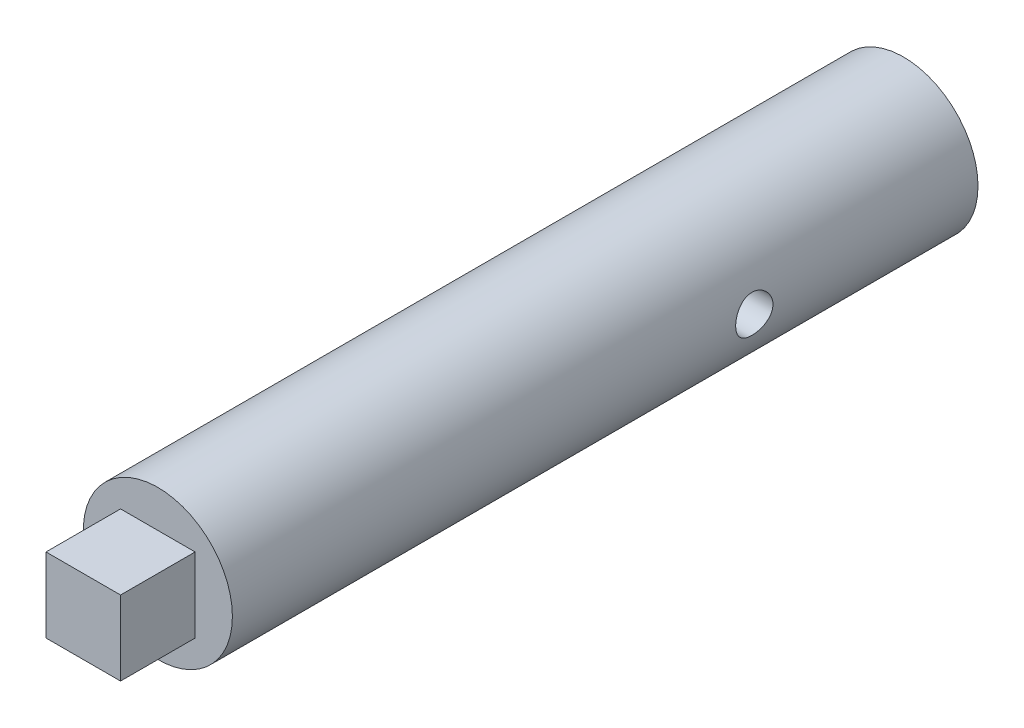
ISO-10303-21;
HEADER;
FILE_DESCRIPTION(('STEP AP214'),'2;1');
FILE_NAME('part.step','',(''),(''),'','','');
FILE_SCHEMA(('AUTOMOTIVE_DESIGN { 1 0 10303 214 1 1 1 1 }'));
ENDSEC;
DATA;
#1=APPLICATION_CONTEXT('core data for automotive mechanical design processes');
#2=APPLICATION_PROTOCOL_DEFINITION('international standard','automotive_design',2000,#1);
#3=PRODUCT_CONTEXT('',#1,'mechanical');
#4=PRODUCT('Part','Part','',(#3));
#5=PRODUCT_RELATED_PRODUCT_CATEGORY('part','',(#4));
#6=PRODUCT_DEFINITION_FORMATION('','',#4);
#7=PRODUCT_DEFINITION_CONTEXT('part definition',#1,'design');
#8=PRODUCT_DEFINITION('design','',#6,#7);
#9=PRODUCT_DEFINITION_SHAPE('','',#8);
#10=(LENGTH_UNIT() NAMED_UNIT(*) SI_UNIT(.MILLI.,.METRE.));
#11=(NAMED_UNIT(*) PLANE_ANGLE_UNIT() SI_UNIT($,.RADIAN.));
#12=(NAMED_UNIT(*) SI_UNIT($,.STERADIAN.) SOLID_ANGLE_UNIT());
#13=UNCERTAINTY_MEASURE_WITH_UNIT(LENGTH_MEASURE(1.E-05),#10,'distance_accuracy_value','');
#14=(GEOMETRIC_REPRESENTATION_CONTEXT(3) GLOBAL_UNCERTAINTY_ASSIGNED_CONTEXT((#13)) GLOBAL_UNIT_ASSIGNED_CONTEXT((#10,
#11,#12)) REPRESENTATION_CONTEXT('',''));
#15=CARTESIAN_POINT('',(0.,0.,0.));
#16=DIRECTION('',(0.,0.,1.));
#17=DIRECTION('',(1.,0.,0.));
#18=AXIS2_PLACEMENT_3D('',#15,#16,#17);
#19=CARTESIAN_POINT('',(0.,0.,50.));
#20=DIRECTION('',(0.,0.,-1.));
#21=DIRECTION('',(-1.,0.,0.));
#22=AXIS2_PLACEMENT_3D('',#19,#20,#21);
#23=CYLINDRICAL_SURFACE('',#22,5.);
#24=CARTESIAN_POINT('',(0.,0.,50.));
#25=DIRECTION('',(0.,0.,1.));
#26=DIRECTION('',(1.,0.,0.));
#27=AXIS2_PLACEMENT_3D('',#24,#25,#26);
#28=CIRCLE('',#27,5.);
#29=CARTESIAN_POINT('',(5.,0.,50.));
#30=VERTEX_POINT('',#29);
#31=EDGE_CURVE('E107',#30,#30,#28,.T.);
#32=ORIENTED_EDGE('',*,*,#31,.F.);
#33=EDGE_LOOP('',(#32));
#34=FACE_BOUND('',#33,.T.);
#35=CARTESIAN_POINT('',(0.,0.,0.));
#36=DIRECTION('',(0.,0.,1.));
#37=DIRECTION('',(1.,0.,0.));
#38=AXIS2_PLACEMENT_3D('',#35,#36,#37);
#39=CIRCLE('',#38,5.);
#40=CARTESIAN_POINT('',(5.,0.,0.));
#41=VERTEX_POINT('',#40);
#42=EDGE_CURVE('E104',#41,#41,#39,.T.);
#43=ORIENTED_EDGE('',*,*,#42,.T.);
#44=EDGE_LOOP('',(#43));
#45=FACE_BOUND('',#44,.T.);
#46=CARTESIAN_POINT('',(-5.,0.,16.25));
#47=CARTESIAN_POINT('',(-4.99999883223344,0.0690634072247758,16.2499980618849));
#48=CARTESIAN_POINT('',(-4.99855481776523,0.138148464858969,16.2442570410218));
#49=CARTESIAN_POINT('',(-4.99293428191577,0.27433860314211,16.2214790405775));
#50=CARTESIAN_POINT('',(-4.98875621183307,0.341442539058949,16.2044356587185));
#51=CARTESIAN_POINT('',(-4.97813021943366,0.471684060152148,16.1596339554483));
#52=CARTESIAN_POINT('',(-4.97168502368406,0.534826302858337,16.1318885010706));
#53=CARTESIAN_POINT('',(-4.95721119839661,0.655560109920356,16.066515508296));
#54=CARTESIAN_POINT('',(-4.94918251545042,0.7131514869573,16.0288876365675));
#55=CARTESIAN_POINT('',(-4.93222844659834,0.822334939417433,15.9439993419548));
#56=CARTESIAN_POINT('',(-4.92328922623777,0.873796408384226,15.896573687534));
#57=CARTESIAN_POINT('',(-4.90561350097941,0.968124106002753,15.7937898292426));
#58=CARTESIAN_POINT('',(-4.89687701906957,1.01098936412428,15.7384307308779));
#59=CARTESIAN_POINT('',(-4.88045646416425,1.08752211899919,15.6203373110521));
#60=CARTESIAN_POINT('',(-4.87278995392171,1.12104351327113,15.5575056409913));
#61=CARTESIAN_POINT('',(-4.85957912343519,1.17699742379211,15.426876323618));
#62=CARTESIAN_POINT('',(-4.85403446393991,1.19943171286611,15.3590794722285));
#63=CARTESIAN_POINT('',(-4.84583730597959,1.23212903067024,15.2218804181646));
#64=CARTESIAN_POINT('',(-4.84312909229522,1.24262689027778,15.1525375866252));
#65=CARTESIAN_POINT('',(-4.84074468781451,1.25188481255654,15.0130261924883));
#66=CARTESIAN_POINT('',(-4.8410680037387,1.25064678484831,14.9428577660845));
#67=CARTESIAN_POINT('',(-4.84466004580515,1.2366554371994,14.8054868268796));
#68=CARTESIAN_POINT('',(-4.84785719168233,1.22418195015877,14.7382536487791));
#69=CARTESIAN_POINT('',(-4.85672258063736,1.18852015575259,14.6068657909073));
#70=CARTESIAN_POINT('',(-4.8623909997558,1.16533108505785,14.5427113308092));
#71=CARTESIAN_POINT('',(-4.87562594920155,1.10865789828096,14.4185516531233));
#72=CARTESIAN_POINT('',(-4.88321106224518,1.07507222269409,14.358594856842));
#73=CARTESIAN_POINT('',(-4.89941425705322,0.998630230012461,14.2450677418693));
#74=CARTESIAN_POINT('',(-4.90803251945613,0.955772290674032,14.1914985432773));
#75=CARTESIAN_POINT('',(-4.92563233783151,0.860552853901014,14.090663653588));
#76=CARTESIAN_POINT('',(-4.93461724564976,0.807955215138216,14.0436212582822));
#77=CARTESIAN_POINT('',(-4.95171637982321,0.695509931253083,13.9589822979467));
#78=CARTESIAN_POINT('',(-4.95983057957846,0.635662064756619,13.921386021447));
#79=CARTESIAN_POINT('',(-4.97431443411819,0.510096573901159,13.8566245114797));
#80=CARTESIAN_POINT('',(-4.98067800106438,0.444359494340519,13.829495549788));
#81=CARTESIAN_POINT('',(-4.99089930826182,0.309063340119069,13.7867355785754));
#82=CARTESIAN_POINT('',(-4.99475752782734,0.23950499929207,13.7711023696516));
#83=CARTESIAN_POINT('',(-4.99946249392812,0.100449975325022,13.7521186953676));
#84=CARTESIAN_POINT('',(-5.00038377923565,0.0309972666568412,13.7484641449372));
#85=CARTESIAN_POINT('',(-4.99932337345376,-0.107527395667923,13.7527075017129));
#86=CARTESIAN_POINT('',(-4.99734194368205,-0.176599383037162,13.7606043689993));
#87=CARTESIAN_POINT('',(-4.99074650939464,-0.31134522398041,13.7874757569928));
#88=CARTESIAN_POINT('',(-4.98617195154843,-0.377054265807296,13.8062843862308));
#89=CARTESIAN_POINT('',(-4.97490588861778,-0.50438107704376,13.854255903357));
#90=CARTESIAN_POINT('',(-4.9682141697491,-0.565998432527195,13.8834198369276));
#91=CARTESIAN_POINT('',(-4.95327756605259,-0.684602612024872,13.9518634407289));
#92=CARTESIAN_POINT('',(-4.94500722805777,-0.741487868196525,13.9913134269973));
#93=CARTESIAN_POINT('',(-4.92787090989516,-0.847938844702704,14.0789915906641));
#94=CARTESIAN_POINT('',(-4.91900482709754,-0.897503299144172,14.1272212830141));
#95=CARTESIAN_POINT('',(-4.90140797467309,-0.989158806727274,14.2325016340371));
#96=CARTESIAN_POINT('',(-4.89268586822734,-1.03103655635169,14.289739752502));
#97=CARTESIAN_POINT('',(-4.87660731981032,-1.10459229917725,14.4106105287214));
#98=CARTESIAN_POINT('',(-4.86925081722522,-1.13627074513161,14.4742429024665));
#99=CARTESIAN_POINT('',(-4.85681745612221,-1.18829285050774,14.6057547686776));
#100=CARTESIAN_POINT('',(-4.85172712743255,-1.20870366387839,14.6736063569533));
#101=CARTESIAN_POINT('',(-4.84438953408486,-1.23778804996148,14.8119246982409));
#102=CARTESIAN_POINT('',(-4.84214164766613,-1.24646418956555,14.8823908758604));
#103=CARTESIAN_POINT('',(-4.84079084336631,-1.25169882527833,15.0217675198793));
#104=CARTESIAN_POINT('',(-4.8415994394022,-1.2485982481501,15.0906645292706));
#105=CARTESIAN_POINT('',(-4.84606590839869,-1.23114773192739,15.2269199072233));
#106=CARTESIAN_POINT('',(-4.84972372409881,-1.21679801890564,15.294278306678));
#107=CARTESIAN_POINT('',(-4.85942717235602,-1.17744276620233,15.4251737158878));
#108=CARTESIAN_POINT('',(-4.86545846030258,-1.15250117056698,15.4887310877002));
#109=CARTESIAN_POINT('',(-4.87923129770691,-1.09272076133756,15.6108044855947));
#110=CARTESIAN_POINT('',(-4.88697308433978,-1.05788057502849,15.6693198109891));
#111=CARTESIAN_POINT('',(-4.90354695219593,-0.97822312386428,15.7812955241684));
#112=CARTESIAN_POINT('',(-4.91240220693131,-0.933169302426878,15.8345842278533));
#113=CARTESIAN_POINT('',(-4.93006689371905,-0.834824475991445,15.9329558706628));
#114=CARTESIAN_POINT('',(-4.93887631439216,-0.781531517717621,15.9780368584275));
#115=CARTESIAN_POINT('',(-4.95564713039719,-0.667056322252158,16.0595094238038));
#116=CARTESIAN_POINT('',(-4.9635902780489,-0.605748685263656,16.0957288447263));
#117=CARTESIAN_POINT('',(-4.97754104145932,-0.47772171625873,16.1572895524504));
#118=CARTESIAN_POINT('',(-4.98355004333151,-0.411006302863949,16.1826386338738));
#119=CARTESIAN_POINT('',(-4.99206716304618,-0.287008544369559,16.2179765252747));
#120=CARTESIAN_POINT('',(-4.99502154210576,-0.230316809090057,16.2299593692112));
#121=CARTESIAN_POINT('',(-4.9989883769329,-0.115755059613569,16.2459716196849));
#122=CARTESIAN_POINT('',(-5.00000097875745,-0.0578851343688468,16.2500016244211));
#123=CARTESIAN_POINT('',(-5.,0.,16.25));
#124=B_SPLINE_CURVE_WITH_KNOTS('',3,(#46,#47,#48,#49,#50,#51,#52,#53,#54,#55,#56,#57,#58,#59,
#60,#61,#62,#63,#64,#65,#66,#67,#68,#69,#70,#71,#72,#73,#74,#75,#76,#77,#78,#79,#80,#81,#82,#83,
#84,#85,#86,#87,#88,#89,#90,#91,#92,#93,#94,#95,#96,#97,#98,#99,#100,#101,#102,#103,#104,#105,
#106,#107,#108,#109,#110,#111,#112,#113,#114,#115,#116,#117,#118,#119,#120,#121,#122,#123),
.UNSPECIFIED.,.T.,.F.,(4,2,2,2,2,2,2,2,2,2,2,2,2,2,2,2,2,2,2,2,2,2,2,2,2,2,2,2,2,2,2,2,2,2,2,2,
2,2,4),(0.,0.206978093726574,0.414073531469916,0.62092075190509,0.827774950141107,
1.03845362864283,1.24915607983385,1.46298872954839,1.6767871764114,1.88630245916192,
2.09578365093914,2.30018747505848,2.50460586221699,2.71108773228233,2.91760575696802,
3.13001250807516,3.34242574631872,3.55556857507595,3.76867061407202,3.97631924124397,
4.18394917593952,4.38850228761698,4.59307606101908,4.80127989637793,5.00951969173349,
5.2228709100373,5.4362126562459,5.6482687884503,5.8602785271034,6.06619816998844,
6.27211367463362,6.47680333799539,6.68152140114084,6.89157980341591,7.10168808142014,
7.31560154582989,7.52936136517791,7.7028520245179,7.87632963369199),.UNSPECIFIED.);
#125=CARTESIAN_POINT('',(-5.,0.,16.25));
#126=VERTEX_POINT('',#125);
#127=EDGE_CURVE('E51',#126,#126,#124,.T.);
#128=ORIENTED_EDGE('',*,*,#127,.F.);
#129=EDGE_LOOP('',(#128));
#130=FACE_BOUND('',#129,.T.);
#131=CARTESIAN_POINT('',(5.,0.,16.25));
#132=CARTESIAN_POINT('',(4.99999883223344,-0.0690634072247758,16.2499980618849));
#133=CARTESIAN_POINT('',(4.99855481776523,-0.138148464858969,16.2442570410218));
#134=CARTESIAN_POINT('',(4.99293428191577,-0.27433860314211,16.2214790405775));
#135=CARTESIAN_POINT('',(4.98875621183307,-0.341442539058949,16.2044356587185));
#136=CARTESIAN_POINT('',(4.97813021943366,-0.471684060152148,16.1596339554483));
#137=CARTESIAN_POINT('',(4.97168502368406,-0.534826302858337,16.1318885010706));
#138=CARTESIAN_POINT('',(4.95721119839661,-0.655560109920356,16.066515508296));
#139=CARTESIAN_POINT('',(4.94918251545042,-0.7131514869573,16.0288876365675));
#140=CARTESIAN_POINT('',(4.93222844659834,-0.822334939417433,15.9439993419548));
#141=CARTESIAN_POINT('',(4.92328922623777,-0.873796408384226,15.896573687534));
#142=CARTESIAN_POINT('',(4.90561350097941,-0.968124106002753,15.7937898292426));
#143=CARTESIAN_POINT('',(4.89687701906957,-1.01098936412428,15.7384307308779));
#144=CARTESIAN_POINT('',(4.88045646416425,-1.08752211899919,15.6203373110521));
#145=CARTESIAN_POINT('',(4.87278995392171,-1.12104351327113,15.5575056409913));
#146=CARTESIAN_POINT('',(4.85957912343519,-1.17699742379211,15.426876323618));
#147=CARTESIAN_POINT('',(4.85403446393991,-1.19943171286611,15.3590794722285));
#148=CARTESIAN_POINT('',(4.84583730597959,-1.23212903067024,15.2218804181646));
#149=CARTESIAN_POINT('',(4.84312909229522,-1.24262689027778,15.1525375866252));
#150=CARTESIAN_POINT('',(4.84074468781451,-1.25188481255654,15.0130261924883));
#151=CARTESIAN_POINT('',(4.8410680037387,-1.25064678484831,14.9428577660845));
#152=CARTESIAN_POINT('',(4.84466004580515,-1.2366554371994,14.8054868268796));
#153=CARTESIAN_POINT('',(4.84785719168233,-1.22418195015877,14.7382536487791));
#154=CARTESIAN_POINT('',(4.85672258063736,-1.18852015575259,14.6068657909073));
#155=CARTESIAN_POINT('',(4.8623909997558,-1.16533108505785,14.5427113308092));
#156=CARTESIAN_POINT('',(4.87562594920155,-1.10865789828096,14.4185516531233));
#157=CARTESIAN_POINT('',(4.88321106224518,-1.07507222269409,14.358594856842));
#158=CARTESIAN_POINT('',(4.89941425705322,-0.998630230012461,14.2450677418693));
#159=CARTESIAN_POINT('',(4.90803251945613,-0.955772290674032,14.1914985432773));
#160=CARTESIAN_POINT('',(4.92563233783151,-0.860552853901014,14.090663653588));
#161=CARTESIAN_POINT('',(4.93461724564976,-0.807955215138216,14.0436212582822));
#162=CARTESIAN_POINT('',(4.95171637982321,-0.695509931253083,13.9589822979467));
#163=CARTESIAN_POINT('',(4.95983057957846,-0.635662064756619,13.921386021447));
#164=CARTESIAN_POINT('',(4.97431443411819,-0.510096573901159,13.8566245114797));
#165=CARTESIAN_POINT('',(4.98067800106438,-0.444359494340519,13.829495549788));
#166=CARTESIAN_POINT('',(4.99089930826182,-0.309063340119069,13.7867355785754));
#167=CARTESIAN_POINT('',(4.99475752782734,-0.23950499929207,13.7711023696516));
#168=CARTESIAN_POINT('',(4.99946249392812,-0.100449975325022,13.7521186953676));
#169=CARTESIAN_POINT('',(5.00038377923565,-0.0309972666568412,13.7484641449372));
#170=CARTESIAN_POINT('',(4.99932337345376,0.107527395667923,13.7527075017129));
#171=CARTESIAN_POINT('',(4.99734194368205,0.176599383037162,13.7606043689993));
#172=CARTESIAN_POINT('',(4.99074650939464,0.31134522398041,13.7874757569928));
#173=CARTESIAN_POINT('',(4.98617195154843,0.377054265807296,13.8062843862308));
#174=CARTESIAN_POINT('',(4.97490588861778,0.50438107704376,13.854255903357));
#175=CARTESIAN_POINT('',(4.9682141697491,0.565998432527195,13.8834198369276));
#176=CARTESIAN_POINT('',(4.95327756605259,0.684602612024872,13.9518634407289));
#177=CARTESIAN_POINT('',(4.94500722805777,0.741487868196525,13.9913134269973));
#178=CARTESIAN_POINT('',(4.92787090989516,0.847938844702704,14.0789915906641));
#179=CARTESIAN_POINT('',(4.91900482709754,0.897503299144172,14.1272212830141));
#180=CARTESIAN_POINT('',(4.90140797467309,0.989158806727274,14.2325016340371));
#181=CARTESIAN_POINT('',(4.89268586822734,1.03103655635169,14.289739752502));
#182=CARTESIAN_POINT('',(4.87660731981032,1.10459229917725,14.4106105287214));
#183=CARTESIAN_POINT('',(4.86925081722522,1.13627074513161,14.4742429024665));
#184=CARTESIAN_POINT('',(4.85681745612221,1.18829285050774,14.6057547686776));
#185=CARTESIAN_POINT('',(4.85172712743255,1.20870366387839,14.6736063569533));
#186=CARTESIAN_POINT('',(4.84438953408486,1.23778804996148,14.8119246982409));
#187=CARTESIAN_POINT('',(4.84214164766613,1.24646418956555,14.8823908758604));
#188=CARTESIAN_POINT('',(4.84079084336631,1.25169882527833,15.0217675198793));
#189=CARTESIAN_POINT('',(4.8415994394022,1.2485982481501,15.0906645292706));
#190=CARTESIAN_POINT('',(4.84606590839869,1.23114773192739,15.2269199072233));
#191=CARTESIAN_POINT('',(4.84972372409881,1.21679801890564,15.294278306678));
#192=CARTESIAN_POINT('',(4.85942717235602,1.17744276620233,15.4251737158878));
#193=CARTESIAN_POINT('',(4.86545846030258,1.15250117056698,15.4887310877002));
#194=CARTESIAN_POINT('',(4.87923129770691,1.09272076133756,15.6108044855947));
#195=CARTESIAN_POINT('',(4.88697308433978,1.05788057502849,15.6693198109891));
#196=CARTESIAN_POINT('',(4.90354695219593,0.97822312386428,15.7812955241684));
#197=CARTESIAN_POINT('',(4.91240220693131,0.933169302426878,15.8345842278533));
#198=CARTESIAN_POINT('',(4.93006689371905,0.834824475991445,15.9329558706628));
#199=CARTESIAN_POINT('',(4.93887631439216,0.781531517717621,15.9780368584275));
#200=CARTESIAN_POINT('',(4.95564713039719,0.667056322252158,16.0595094238038));
#201=CARTESIAN_POINT('',(4.9635902780489,0.605748685263656,16.0957288447263));
#202=CARTESIAN_POINT('',(4.97754104145932,0.47772171625873,16.1572895524504));
#203=CARTESIAN_POINT('',(4.98355004333151,0.411006302863949,16.1826386338738));
#204=CARTESIAN_POINT('',(4.99206716304618,0.287008544369559,16.2179765252747));
#205=CARTESIAN_POINT('',(4.99502154210576,0.230316809090057,16.2299593692112));
#206=CARTESIAN_POINT('',(4.9989883769329,0.115755059613569,16.2459716196849));
#207=CARTESIAN_POINT('',(5.00000097875745,0.0578851343688468,16.2500016244211));
#208=CARTESIAN_POINT('',(5.,0.,16.25));
#209=B_SPLINE_CURVE_WITH_KNOTS('',3,(#131,#132,#133,#134,#135,#136,#137,#138,#139,#140,#141,
#142,#143,#144,#145,#146,#147,#148,#149,#150,#151,#152,#153,#154,#155,#156,#157,#158,#159,#160,
#161,#162,#163,#164,#165,#166,#167,#168,#169,#170,#171,#172,#173,#174,#175,#176,#177,#178,#179,
#180,#181,#182,#183,#184,#185,#186,#187,#188,#189,#190,#191,#192,#193,#194,#195,#196,#197,#198,
#199,#200,#201,#202,#203,#204,#205,#206,#207,#208),.UNSPECIFIED.,.T.,.F.,(4,2,2,2,2,2,2,2,2,2,2,
2,2,2,2,2,2,2,2,2,2,2,2,2,2,2,2,2,2,2,2,2,2,2,2,2,2,2,4),(0.,0.206978093726574,
0.414073531469916,0.62092075190509,0.827774950141107,1.03845362864283,1.24915607983385,
1.46298872954839,1.6767871764114,1.88630245916192,2.09578365093914,2.30018747505848,
2.50460586221699,2.71108773228233,2.91760575696802,3.13001250807516,3.34242574631872,
3.55556857507595,3.76867061407202,3.97631924124397,4.18394917593952,4.38850228761698,
4.59307606101908,4.80127989637793,5.00951969173349,5.2228709100373,5.4362126562459,
5.6482687884503,5.8602785271034,6.06619816998844,6.27211367463362,6.47680333799539,
6.68152140114084,6.89157980341591,7.10168808142014,7.31560154582989,7.52936136517791,
7.7028520245179,7.87632963369199),.UNSPECIFIED.);
#210=CARTESIAN_POINT('',(5.,0.,16.25));
#211=VERTEX_POINT('',#210);
#212=EDGE_CURVE('E11',#211,#211,#209,.T.);
#213=ORIENTED_EDGE('',*,*,#212,.F.);
#214=EDGE_LOOP('',(#213));
#215=FACE_BOUND('',#214,.T.);
#216=ADVANCED_FACE('F39',(#34,#45,#130,#215),#23,.T.);
#217=CARTESIAN_POINT('',(0.,0.,50.));
#218=DIRECTION('',(0.,0.,1.));
#219=DIRECTION('',(1.,0.,0.));
#220=AXIS2_PLACEMENT_3D('',#217,#218,#219);
#221=PLANE('',#220);
#222=DIRECTION('',(0.,-1.,0.));
#223=VECTOR('',#222,1.);
#224=CARTESIAN_POINT('',(-2.5,-2.5,50.));
#225=LINE('',#224,#223);
#226=CARTESIAN_POINT('',(-2.5,2.5,50.));
#227=VERTEX_POINT('',#226);
#228=CARTESIAN_POINT('',(-2.5,-2.5,50.));
#229=VERTEX_POINT('',#228);
#230=EDGE_CURVE('E58',#227,#229,#225,.T.);
#231=ORIENTED_EDGE('',*,*,#230,.F.);
#232=DIRECTION('',(-1.,0.,0.));
#233=VECTOR('',#232,1.);
#234=CARTESIAN_POINT('',(-2.5,2.5,50.));
#235=LINE('',#234,#233);
#236=CARTESIAN_POINT('',(2.5,2.5,50.));
#237=VERTEX_POINT('',#236);
#238=EDGE_CURVE('E62',#237,#227,#235,.T.);
#239=ORIENTED_EDGE('',*,*,#238,.F.);
#240=DIRECTION('',(0.,1.,0.));
#241=VECTOR('',#240,1.);
#242=CARTESIAN_POINT('',(2.5,-2.5,50.));
#243=LINE('',#242,#241);
#244=CARTESIAN_POINT('',(2.5,-2.5,50.));
#245=VERTEX_POINT('',#244);
#246=EDGE_CURVE('E209',#245,#237,#243,.T.);
#247=ORIENTED_EDGE('',*,*,#246,.F.);
#248=DIRECTION('',(1.,0.,0.));
#249=VECTOR('',#248,1.);
#250=CARTESIAN_POINT('',(-2.5,-2.5,50.));
#251=LINE('',#250,#249);
#252=EDGE_CURVE('E211',#229,#245,#251,.T.);
#253=ORIENTED_EDGE('',*,*,#252,.F.);
#254=EDGE_LOOP('',(#231,#239,#247,#253));
#255=FACE_BOUND('',#254,.T.);
#256=ORIENTED_EDGE('',*,*,#31,.T.);
#257=EDGE_LOOP('',(#256));
#258=FACE_BOUND('',#257,.T.);
#259=ADVANCED_FACE('F139',(#255,#258),#221,.T.);
#260=CARTESIAN_POINT('',(0.,0.,0.));
#261=DIRECTION('',(0.,0.,1.));
#262=DIRECTION('',(1.,0.,0.));
#263=AXIS2_PLACEMENT_3D('',#260,#261,#262);
#264=PLANE('',#263);
#265=ORIENTED_EDGE('',*,*,#42,.F.);
#266=EDGE_LOOP('',(#265));
#267=FACE_BOUND('',#266,.T.);
#268=ADVANCED_FACE('F138',(#267),#264,.F.);
#269=CARTESIAN_POINT('',(-2.5,-2.5,55.));
#270=DIRECTION('',(1.,0.,0.));
#271=DIRECTION('',(0.,1.,0.));
#272=AXIS2_PLACEMENT_3D('',#269,#270,#271);
#273=PLANE('',#272);
#274=ORIENTED_EDGE('',*,*,#230,.T.);
#275=DIRECTION('',(0.,0.,-1.));
#276=VECTOR('',#275,1.);
#277=CARTESIAN_POINT('',(-2.5,-2.5,55.));
#278=LINE('',#277,#276);
#279=CARTESIAN_POINT('',(-2.5,-2.5,55.));
#280=VERTEX_POINT('',#279);
#281=EDGE_CURVE('E87',#280,#229,#278,.T.);
#282=ORIENTED_EDGE('',*,*,#281,.F.);
#283=DIRECTION('',(0.,-1.,0.));
#284=VECTOR('',#283,1.);
#285=CARTESIAN_POINT('',(-2.5,-2.5,55.));
#286=LINE('',#285,#284);
#287=CARTESIAN_POINT('',(-2.5,2.5,55.));
#288=VERTEX_POINT('',#287);
#289=EDGE_CURVE('E93',#288,#280,#286,.T.);
#290=ORIENTED_EDGE('',*,*,#289,.F.);
#291=DIRECTION('',(0.,0.,-1.));
#292=VECTOR('',#291,1.);
#293=CARTESIAN_POINT('',(-2.5,2.5,55.));
#294=LINE('',#293,#292);
#295=EDGE_CURVE('E213',#288,#227,#294,.T.);
#296=ORIENTED_EDGE('',*,*,#295,.T.);
#297=EDGE_LOOP('',(#274,#282,#290,#296));
#298=FACE_BOUND('',#297,.T.);
#299=ADVANCED_FACE('F103',(#298),#273,.F.);
#300=CARTESIAN_POINT('',(-2.5,-2.5,55.));
#301=DIRECTION('',(0.,1.,0.));
#302=DIRECTION('',(0.,0.,1.));
#303=AXIS2_PLACEMENT_3D('',#300,#301,#302);
#304=PLANE('',#303);
#305=ORIENTED_EDGE('',*,*,#252,.T.);
#306=DIRECTION('',(0.,0.,-1.));
#307=VECTOR('',#306,1.);
#308=CARTESIAN_POINT('',(2.5,-2.5,55.));
#309=LINE('',#308,#307);
#310=CARTESIAN_POINT('',(2.5,-2.5,55.));
#311=VERTEX_POINT('',#310);
#312=EDGE_CURVE('E89',#311,#245,#309,.T.);
#313=ORIENTED_EDGE('',*,*,#312,.F.);
#314=DIRECTION('',(1.,0.,0.));
#315=VECTOR('',#314,1.);
#316=CARTESIAN_POINT('',(-2.5,-2.5,55.));
#317=LINE('',#316,#315);
#318=EDGE_CURVE('E82',#280,#311,#317,.T.);
#319=ORIENTED_EDGE('',*,*,#318,.F.);
#320=ORIENTED_EDGE('',*,*,#281,.T.);
#321=EDGE_LOOP('',(#305,#313,#319,#320));
#322=FACE_BOUND('',#321,.T.);
#323=ADVANCED_FACE('F85',(#322),#304,.F.);
#324=CARTESIAN_POINT('',(2.5,-2.5,55.));
#325=DIRECTION('',(-1.,0.,0.));
#326=DIRECTION('',(0.,-1.,0.));
#327=AXIS2_PLACEMENT_3D('',#324,#325,#326);
#328=PLANE('',#327);
#329=ORIENTED_EDGE('',*,*,#246,.T.);
#330=DIRECTION('',(0.,0.,-1.));
#331=VECTOR('',#330,1.);
#332=CARTESIAN_POINT('',(2.5,2.5,55.));
#333=LINE('',#332,#331);
#334=CARTESIAN_POINT('',(2.5,2.5,55.));
#335=VERTEX_POINT('',#334);
#336=EDGE_CURVE('E109',#335,#237,#333,.T.);
#337=ORIENTED_EDGE('',*,*,#336,.F.);
#338=DIRECTION('',(0.,1.,0.));
#339=VECTOR('',#338,1.);
#340=CARTESIAN_POINT('',(2.5,-2.5,55.));
#341=LINE('',#340,#339);
#342=EDGE_CURVE('E92',#311,#335,#341,.T.);
#343=ORIENTED_EDGE('',*,*,#342,.F.);
#344=ORIENTED_EDGE('',*,*,#312,.T.);
#345=EDGE_LOOP('',(#329,#337,#343,#344));
#346=FACE_BOUND('',#345,.T.);
#347=ADVANCED_FACE('F129',(#346),#328,.F.);
#348=CARTESIAN_POINT('',(-2.5,2.5,55.));
#349=DIRECTION('',(0.,-1.,0.));
#350=DIRECTION('',(0.,0.,-1.));
#351=AXIS2_PLACEMENT_3D('',#348,#349,#350);
#352=PLANE('',#351);
#353=ORIENTED_EDGE('',*,*,#238,.T.);
#354=ORIENTED_EDGE('',*,*,#295,.F.);
#355=DIRECTION('',(-1.,0.,0.));
#356=VECTOR('',#355,1.);
#357=CARTESIAN_POINT('',(-2.5,2.5,55.));
#358=LINE('',#357,#356);
#359=EDGE_CURVE('E98',#335,#288,#358,.T.);
#360=ORIENTED_EDGE('',*,*,#359,.F.);
#361=ORIENTED_EDGE('',*,*,#336,.T.);
#362=EDGE_LOOP('',(#353,#354,#360,#361));
#363=FACE_BOUND('',#362,.T.);
#364=ADVANCED_FACE('F126',(#363),#352,.F.);
#365=CARTESIAN_POINT('',(0.,0.,55.));
#366=DIRECTION('',(0.,0.,-1.));
#367=DIRECTION('',(-1.,0.,0.));
#368=AXIS2_PLACEMENT_3D('',#365,#366,#367);
#369=PLANE('',#368);
#370=ORIENTED_EDGE('',*,*,#289,.T.);
#371=ORIENTED_EDGE('',*,*,#318,.T.);
#372=ORIENTED_EDGE('',*,*,#342,.T.);
#373=ORIENTED_EDGE('',*,*,#359,.T.);
#374=EDGE_LOOP('',(#370,#371,#372,#373));
#375=FACE_BOUND('',#374,.T.);
#376=ADVANCED_FACE('F96',(#375),#369,.F.);
#377=CARTESIAN_POINT('',(5.,0.,15.));
#378=DIRECTION('',(-1.,0.,0.));
#379=DIRECTION('',(0.,0.,1.));
#380=AXIS2_PLACEMENT_3D('',#377,#378,#379);
#381=CYLINDRICAL_SURFACE('',#380,1.25);
#382=ORIENTED_EDGE('',*,*,#127,.T.);
#383=EDGE_LOOP('',(#382));
#384=FACE_BOUND('',#383,.T.);
#385=ORIENTED_EDGE('',*,*,#212,.T.);
#386=EDGE_LOOP('',(#385));
#387=FACE_BOUND('',#386,.T.);
#388=ADVANCED_FACE('F118',(#384,#387),#381,.F.);
#389=CLOSED_SHELL('',(#216,#259,#268,#299,#323,#347,#364,#376,#388));
#390=MANIFOLD_SOLID_BREP('B2',#389);
#391=ADVANCED_BREP_SHAPE_REPRESENTATION('',(#18,#390),#14);
#392=SHAPE_DEFINITION_REPRESENTATION(#9,#391);
ENDSEC;
END-ISO-10303-21;
